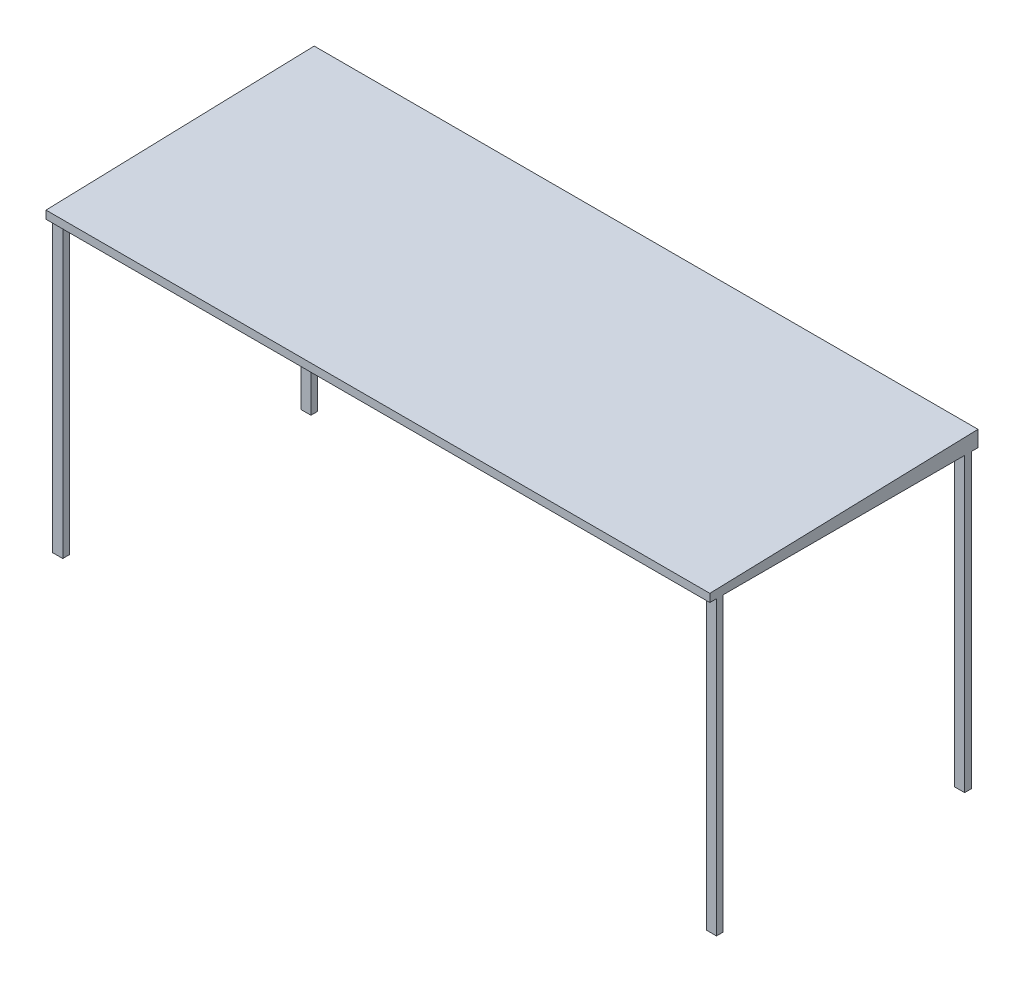
ISO-10303-21;
HEADER;
FILE_DESCRIPTION(('STEP AP214'),'2;1');
FILE_NAME('part.step','',(''),(''),'','','');
FILE_SCHEMA(('AUTOMOTIVE_DESIGN { 1 0 10303 214 1 1 1 1 }'));
ENDSEC;
DATA;
#1=APPLICATION_CONTEXT('core data for automotive mechanical design processes');
#2=APPLICATION_PROTOCOL_DEFINITION('international standard','automotive_design',2000,#1);
#3=PRODUCT_CONTEXT('',#1,'mechanical');
#4=PRODUCT('Part','Part','',(#3));
#5=PRODUCT_RELATED_PRODUCT_CATEGORY('part','',(#4));
#6=PRODUCT_DEFINITION_FORMATION('','',#4);
#7=PRODUCT_DEFINITION_CONTEXT('part definition',#1,'design');
#8=PRODUCT_DEFINITION('design','',#6,#7);
#9=PRODUCT_DEFINITION_SHAPE('','',#8);
#10=(LENGTH_UNIT() NAMED_UNIT(*) SI_UNIT(.MILLI.,.METRE.));
#11=(NAMED_UNIT(*) PLANE_ANGLE_UNIT() SI_UNIT($,.RADIAN.));
#12=(NAMED_UNIT(*) SI_UNIT($,.STERADIAN.) SOLID_ANGLE_UNIT());
#13=UNCERTAINTY_MEASURE_WITH_UNIT(LENGTH_MEASURE(1.E-05),#10,'distance_accuracy_value','');
#14=(GEOMETRIC_REPRESENTATION_CONTEXT(3) GLOBAL_UNCERTAINTY_ASSIGNED_CONTEXT((#13)) GLOBAL_UNIT_ASSIGNED_CONTEXT((#10,
#11,#12)) REPRESENTATION_CONTEXT('',''));
#15=CARTESIAN_POINT('',(0.,0.,0.));
#16=DIRECTION('',(0.,0.,1.));
#17=DIRECTION('',(1.,0.,0.));
#18=AXIS2_PLACEMENT_3D('',#15,#16,#17);
#19=CARTESIAN_POINT('',(-2023.5612172603,2200.,1970.));
#20=DIRECTION('',(0.,-1.,0.));
#21=DIRECTION('',(0.,0.,-1.));
#22=AXIS2_PLACEMENT_3D('',#19,#20,#21);
#23=PLANE('',#22);
#24=DIRECTION('',(0.,0.,-1.));
#25=VECTOR('',#24,1.);
#26=CARTESIAN_POINT('',(5000.,2200.,1970.));
#27=LINE('',#26,#25);
#28=CARTESIAN_POINT('',(5000.,2200.,1869.2));
#29=VERTEX_POINT('',#28);
#30=CARTESIAN_POINT('',(5000.,2200.,50.8));
#31=VERTEX_POINT('',#30);
#32=EDGE_CURVE('E197',#29,#31,#27,.T.);
#33=ORIENTED_EDGE('',*,*,#32,.F.);
#34=DIRECTION('',(-1.,0.,0.));
#35=VECTOR('',#34,1.);
#36=CARTESIAN_POINT('',(5000.,2200.,1869.2));
#37=LINE('',#36,#35);
#38=CARTESIAN_POINT('',(4923.8,2200.,1869.2));
#39=VERTEX_POINT('',#38);
#40=EDGE_CURVE('E180',#29,#39,#37,.T.);
#41=ORIENTED_EDGE('',*,*,#40,.T.);
#42=DIRECTION('',(0.,0.,1.));
#43=VECTOR('',#42,1.);
#44=CARTESIAN_POINT('',(4923.8,2200.,1920.));
#45=LINE('',#44,#43);
#46=CARTESIAN_POINT('',(4923.8,2200.,1920.));
#47=VERTEX_POINT('',#46);
#48=EDGE_CURVE('E188',#39,#47,#45,.T.);
#49=ORIENTED_EDGE('',*,*,#48,.T.);
#50=DIRECTION('',(1.,0.,0.));
#51=VECTOR('',#50,1.);
#52=CARTESIAN_POINT('',(5000.,2200.,1920.));
#53=LINE('',#52,#51);
#54=CARTESIAN_POINT('',(5000.,2200.,1920.));
#55=VERTEX_POINT('',#54);
#56=EDGE_CURVE('E194',#47,#55,#53,.T.);
#57=ORIENTED_EDGE('',*,*,#56,.T.);
#58=CARTESIAN_POINT('',(5000.,2200.,1970.));
#59=VERTEX_POINT('',#58);
#60=EDGE_CURVE('E281',#59,#55,#27,.T.);
#61=ORIENTED_EDGE('',*,*,#60,.F.);
#62=DIRECTION('',(1.,0.,0.));
#63=VECTOR('',#62,1.);
#64=CARTESIAN_POINT('',(-2023.5612172603,2200.,1970.));
#65=LINE('',#64,#63);
#66=CARTESIAN_POINT('',(4.44089209850063E-13,2200.,1970.));
#67=VERTEX_POINT('',#66);
#68=EDGE_CURVE('E290',#67,#59,#65,.T.);
#69=ORIENTED_EDGE('',*,*,#68,.F.);
#70=DIRECTION('',(0.,0.,1.));
#71=VECTOR('',#70,1.);
#72=CARTESIAN_POINT('',(4.44089209850063E-13,2200.,1970.));
#73=LINE('',#72,#71);
#74=CARTESIAN_POINT('',(4.37965975854326E-13,2200.,1920.));
#75=VERTEX_POINT('',#74);
#76=EDGE_CURVE('E277',#75,#67,#73,.T.);
#77=ORIENTED_EDGE('',*,*,#76,.F.);
#78=DIRECTION('',(1.,0.,0.));
#79=VECTOR('',#78,1.);
#80=CARTESIAN_POINT('',(8.88178419700125E-13,2200.,1920.));
#81=LINE('',#80,#79);
#82=CARTESIAN_POINT('',(76.2000000000009,2200.,1920.));
#83=VERTEX_POINT('',#82);
#84=EDGE_CURVE('E60',#75,#83,#81,.T.);
#85=ORIENTED_EDGE('',*,*,#84,.T.);
#86=DIRECTION('',(0.,0.,-1.));
#87=VECTOR('',#86,1.);
#88=CARTESIAN_POINT('',(76.2000000000009,2200.,1920.));
#89=LINE('',#88,#87);
#90=CARTESIAN_POINT('',(76.2000000000009,2200.,1869.2));
#91=VERTEX_POINT('',#90);
#92=EDGE_CURVE('E215',#83,#91,#89,.T.);
#93=ORIENTED_EDGE('',*,*,#92,.T.);
#94=DIRECTION('',(-1.,0.,0.));
#95=VECTOR('',#94,1.);
#96=CARTESIAN_POINT('',(8.88178419700125E-13,2200.,1869.2));
#97=LINE('',#96,#95);
#98=CARTESIAN_POINT('',(8.88178419700125E-13,2200.,1869.2));
#99=VERTEX_POINT('',#98);
#100=EDGE_CURVE('E219',#91,#99,#97,.T.);
#101=ORIENTED_EDGE('',*,*,#100,.T.);
#102=CARTESIAN_POINT('',(0.,2200.,50.8));
#103=VERTEX_POINT('',#102);
#104=EDGE_CURVE('E302',#103,#99,#73,.T.);
#105=ORIENTED_EDGE('',*,*,#104,.F.);
#106=DIRECTION('',(1.,0.,0.));
#107=VECTOR('',#106,1.);
#108=CARTESIAN_POINT('',(0.,2200.,50.8));
#109=LINE('',#108,#107);
#110=CARTESIAN_POINT('',(76.2,2200.,50.8));
#111=VERTEX_POINT('',#110);
#112=EDGE_CURVE('E303',#103,#111,#109,.T.);
#113=ORIENTED_EDGE('',*,*,#112,.T.);
#114=DIRECTION('',(0.,0.,-1.));
#115=VECTOR('',#114,1.);
#116=CARTESIAN_POINT('',(76.2,2200.,0.));
#117=LINE('',#116,#115);
#118=CARTESIAN_POINT('',(76.2,2200.,0.));
#119=VERTEX_POINT('',#118);
#120=EDGE_CURVE('E306',#111,#119,#117,.T.);
#121=ORIENTED_EDGE('',*,*,#120,.T.);
#122=DIRECTION('',(-1.,0.,0.));
#123=VECTOR('',#122,1.);
#124=CARTESIAN_POINT('',(0.,2200.,0.));
#125=LINE('',#124,#123);
#126=CARTESIAN_POINT('',(2.02833790418034E-13,2200.,0.));
#127=VERTEX_POINT('',#126);
#128=EDGE_CURVE('E310',#119,#127,#125,.T.);
#129=ORIENTED_EDGE('',*,*,#128,.T.);
#130=CARTESIAN_POINT('',(4.44089209850063E-13,2200.,-50.));
#131=VERTEX_POINT('',#130);
#132=EDGE_CURVE('E298',#131,#127,#73,.T.);
#133=ORIENTED_EDGE('',*,*,#132,.F.);
#134=DIRECTION('',(1.,0.,0.));
#135=VECTOR('',#134,1.);
#136=CARTESIAN_POINT('',(-2023.5612172603,2200.,-50.));
#137=LINE('',#136,#135);
#138=CARTESIAN_POINT('',(5000.,2200.,-50.));
#139=VERTEX_POINT('',#138);
#140=EDGE_CURVE('E294',#131,#139,#137,.T.);
#141=ORIENTED_EDGE('',*,*,#140,.T.);
#142=CARTESIAN_POINT('',(5000.,2200.,0.));
#143=VERTEX_POINT('',#142);
#144=EDGE_CURVE('E280',#143,#139,#27,.T.);
#145=ORIENTED_EDGE('',*,*,#144,.F.);
#146=DIRECTION('',(-1.,0.,0.));
#147=VECTOR('',#146,1.);
#148=CARTESIAN_POINT('',(5000.,2200.,0.));
#149=LINE('',#148,#147);
#150=CARTESIAN_POINT('',(4923.8,2200.,0.));
#151=VERTEX_POINT('',#150);
#152=EDGE_CURVE('E241',#143,#151,#149,.T.);
#153=ORIENTED_EDGE('',*,*,#152,.T.);
#154=DIRECTION('',(0.,0.,1.));
#155=VECTOR('',#154,1.);
#156=CARTESIAN_POINT('',(4923.8,2200.,0.));
#157=LINE('',#156,#155);
#158=CARTESIAN_POINT('',(4923.8,2200.,50.8));
#159=VERTEX_POINT('',#158);
#160=EDGE_CURVE('E244',#151,#159,#157,.T.);
#161=ORIENTED_EDGE('',*,*,#160,.T.);
#162=DIRECTION('',(1.,0.,0.));
#163=VECTOR('',#162,1.);
#164=CARTESIAN_POINT('',(5000.,2200.,50.8));
#165=LINE('',#164,#163);
#166=EDGE_CURVE('E248',#159,#31,#165,.T.);
#167=ORIENTED_EDGE('',*,*,#166,.T.);
#168=EDGE_LOOP('',(#33,#41,#49,#57,#61,#69,#77,#85,#93,#101,#105,#113,#121,#129,#133,#141,#145,
#153,#161,#167));
#169=FACE_BOUND('',#168,.T.);
#170=ADVANCED_FACE('F37',(#169),#23,.T.);
#171=CARTESIAN_POINT('',(0.,2200.,0.));
#172=DIRECTION('',(1.,0.,0.));
#173=DIRECTION('',(0.,0.,-1.));
#174=AXIS2_PLACEMENT_3D('',#171,#172,#173);
#175=PLANE('',#174);
#176=DIRECTION('',(0.,0.,1.));
#177=VECTOR('',#176,1.);
#178=CARTESIAN_POINT('',(0.,0.,0.));
#179=LINE('',#178,#177);
#180=CARTESIAN_POINT('',(0.,0.,0.));
#181=VERTEX_POINT('',#180);
#182=CARTESIAN_POINT('',(0.,0.,50.8));
#183=VERTEX_POINT('',#182);
#184=EDGE_CURVE('E301',#181,#183,#179,.T.);
#185=ORIENTED_EDGE('',*,*,#184,.T.);
#186=DIRECTION('',(0.,-1.,0.));
#187=VECTOR('',#186,1.);
#188=CARTESIAN_POINT('',(0.,2200.,50.8));
#189=LINE('',#188,#187);
#190=EDGE_CURVE('E11',#103,#183,#189,.T.);
#191=ORIENTED_EDGE('',*,*,#190,.F.);
#192=ORIENTED_EDGE('',*,*,#104,.T.);
#193=DIRECTION('',(0.,-1.,0.));
#194=VECTOR('',#193,1.);
#195=CARTESIAN_POINT('',(8.88178419700125E-13,2200.,1869.2));
#196=LINE('',#195,#194);
#197=CARTESIAN_POINT('',(8.88178419700125E-13,0.,1869.2));
#198=VERTEX_POINT('',#197);
#199=EDGE_CURVE('E231',#99,#198,#196,.T.);
#200=ORIENTED_EDGE('',*,*,#199,.T.);
#201=DIRECTION('',(0.,0.,1.));
#202=VECTOR('',#201,1.);
#203=CARTESIAN_POINT('',(8.88178419700125E-13,0.,1920.));
#204=LINE('',#203,#202);
#205=CARTESIAN_POINT('',(8.88178419700125E-13,0.,1920.));
#206=VERTEX_POINT('',#205);
#207=EDGE_CURVE('E216',#198,#206,#204,.T.);
#208=ORIENTED_EDGE('',*,*,#207,.T.);
#209=DIRECTION('',(0.,-1.,0.));
#210=VECTOR('',#209,1.);
#211=CARTESIAN_POINT('',(8.88178419700125E-13,2200.,1920.));
#212=LINE('',#211,#210);
#213=EDGE_CURVE('E222',#75,#206,#212,.T.);
#214=ORIENTED_EDGE('',*,*,#213,.F.);
#215=ORIENTED_EDGE('',*,*,#76,.T.);
#216=DIRECTION('',(0.,1.,0.));
#217=VECTOR('',#216,1.);
#218=CARTESIAN_POINT('',(4.44089209850063E-13,2260.,1970.));
#219=LINE('',#218,#217);
#220=CARTESIAN_POINT('',(2.47378653427765E-13,2260.,1970.));
#221=VERTEX_POINT('',#220);
#222=EDGE_CURVE('E275',#67,#221,#219,.T.);
#223=ORIENTED_EDGE('',*,*,#222,.T.);
#224=DIRECTION('',(0.,0.0296898759938942,-0.999559158461103));
#225=VECTOR('',#224,1.);
#226=CARTESIAN_POINT('',(0.,2320.,-50.0000000000003));
#227=LINE('',#226,#225);
#228=CARTESIAN_POINT('',(0.,2320.,-50.));
#229=VERTEX_POINT('',#228);
#230=EDGE_CURVE('E272',#221,#229,#227,.T.);
#231=ORIENTED_EDGE('',*,*,#230,.T.);
#232=DIRECTION('',(0.,-1.,0.));
#233=VECTOR('',#232,1.);
#234=CARTESIAN_POINT('',(0.,2200.,-50.));
#235=LINE('',#234,#233);
#236=EDGE_CURVE('E270',#229,#131,#235,.T.);
#237=ORIENTED_EDGE('',*,*,#236,.T.);
#238=ORIENTED_EDGE('',*,*,#132,.T.);
#239=DIRECTION('',(0.,-1.,0.));
#240=VECTOR('',#239,1.);
#241=CARTESIAN_POINT('',(0.,2200.,0.));
#242=LINE('',#241,#240);
#243=EDGE_CURVE('E313',#127,#181,#242,.T.);
#244=ORIENTED_EDGE('',*,*,#243,.T.);
#245=EDGE_LOOP('',(#185,#191,#192,#200,#208,#214,#215,#223,#231,#237,#238,#244));
#246=FACE_BOUND('',#245,.T.);
#247=ADVANCED_FACE('F39',(#246),#175,.F.);
#248=CARTESIAN_POINT('',(0.,2200.,50.8));
#249=DIRECTION('',(0.,0.,-1.));
#250=DIRECTION('',(-1.,0.,0.));
#251=AXIS2_PLACEMENT_3D('',#248,#249,#250);
#252=PLANE('',#251);
#253=DIRECTION('',(1.,0.,0.));
#254=VECTOR('',#253,1.);
#255=CARTESIAN_POINT('',(0.,0.,50.8));
#256=LINE('',#255,#254);
#257=CARTESIAN_POINT('',(76.2,0.,50.8));
#258=VERTEX_POINT('',#257);
#259=EDGE_CURVE('E316',#183,#258,#256,.T.);
#260=ORIENTED_EDGE('',*,*,#259,.T.);
#261=DIRECTION('',(0.,-1.,0.));
#262=VECTOR('',#261,1.);
#263=CARTESIAN_POINT('',(76.2,2200.,50.8));
#264=LINE('',#263,#262);
#265=EDGE_CURVE('E45',#111,#258,#264,.T.);
#266=ORIENTED_EDGE('',*,*,#265,.F.);
#267=ORIENTED_EDGE('',*,*,#112,.F.);
#268=ORIENTED_EDGE('',*,*,#190,.T.);
#269=EDGE_LOOP('',(#260,#266,#267,#268));
#270=FACE_BOUND('',#269,.T.);
#271=ADVANCED_FACE('F347',(#270),#252,.F.);
#272=CARTESIAN_POINT('',(76.2,2200.,0.));
#273=DIRECTION('',(-1.,0.,0.));
#274=DIRECTION('',(0.,0.,1.));
#275=AXIS2_PLACEMENT_3D('',#272,#273,#274);
#276=PLANE('',#275);
#277=DIRECTION('',(0.,0.,-1.));
#278=VECTOR('',#277,1.);
#279=CARTESIAN_POINT('',(76.2,0.,0.));
#280=LINE('',#279,#278);
#281=CARTESIAN_POINT('',(76.2,0.,0.));
#282=VERTEX_POINT('',#281);
#283=EDGE_CURVE('E318',#258,#282,#280,.T.);
#284=ORIENTED_EDGE('',*,*,#283,.T.);
#285=DIRECTION('',(0.,-1.,0.));
#286=VECTOR('',#285,1.);
#287=CARTESIAN_POINT('',(76.2,2200.,0.));
#288=LINE('',#287,#286);
#289=EDGE_CURVE('E323',#119,#282,#288,.T.);
#290=ORIENTED_EDGE('',*,*,#289,.F.);
#291=ORIENTED_EDGE('',*,*,#120,.F.);
#292=ORIENTED_EDGE('',*,*,#265,.T.);
#293=EDGE_LOOP('',(#284,#290,#291,#292));
#294=FACE_BOUND('',#293,.T.);
#295=ADVANCED_FACE('F329',(#294),#276,.F.);
#296=CARTESIAN_POINT('',(0.,2200.,0.));
#297=DIRECTION('',(0.,0.,1.));
#298=DIRECTION('',(1.,0.,0.));
#299=AXIS2_PLACEMENT_3D('',#296,#297,#298);
#300=PLANE('',#299);
#301=DIRECTION('',(-1.,0.,0.));
#302=VECTOR('',#301,1.);
#303=CARTESIAN_POINT('',(0.,0.,0.));
#304=LINE('',#303,#302);
#305=EDGE_CURVE('E307',#282,#181,#304,.T.);
#306=ORIENTED_EDGE('',*,*,#305,.T.);
#307=ORIENTED_EDGE('',*,*,#243,.F.);
#308=ORIENTED_EDGE('',*,*,#128,.F.);
#309=ORIENTED_EDGE('',*,*,#289,.T.);
#310=EDGE_LOOP('',(#306,#307,#308,#309));
#311=FACE_BOUND('',#310,.T.);
#312=ADVANCED_FACE('F336',(#311),#300,.F.);
#313=CARTESIAN_POINT('',(0.,0.,0.));
#314=DIRECTION('',(0.,1.,0.));
#315=DIRECTION('',(0.,0.,1.));
#316=AXIS2_PLACEMENT_3D('',#313,#314,#315);
#317=PLANE('',#316);
#318=ORIENTED_EDGE('',*,*,#184,.F.);
#319=ORIENTED_EDGE('',*,*,#305,.F.);
#320=ORIENTED_EDGE('',*,*,#283,.F.);
#321=ORIENTED_EDGE('',*,*,#259,.F.);
#322=EDGE_LOOP('',(#318,#319,#320,#321));
#323=FACE_BOUND('',#322,.T.);
#324=ADVANCED_FACE('F334',(#323),#317,.F.);
#325=CARTESIAN_POINT('',(-2023.5612172603,2260.,1970.));
#326=DIRECTION('',(0.,0.,1.));
#327=DIRECTION('',(0.,-1.,0.));
#328=AXIS2_PLACEMENT_3D('',#325,#326,#327);
#329=PLANE('',#328);
#330=ORIENTED_EDGE('',*,*,#222,.F.);
#331=ORIENTED_EDGE('',*,*,#68,.T.);
#332=DIRECTION('',(0.,-1.,0.));
#333=VECTOR('',#332,1.);
#334=CARTESIAN_POINT('',(5000.,2260.,1970.));
#335=LINE('',#334,#333);
#336=CARTESIAN_POINT('',(5000.,2260.,1970.));
#337=VERTEX_POINT('',#336);
#338=EDGE_CURVE('E269',#337,#59,#335,.T.);
#339=ORIENTED_EDGE('',*,*,#338,.F.);
#340=DIRECTION('',(1.,0.,0.));
#341=VECTOR('',#340,1.);
#342=CARTESIAN_POINT('',(-2023.5612172603,2260.,1970.));
#343=LINE('',#342,#341);
#344=EDGE_CURVE('E273',#221,#337,#343,.T.);
#345=ORIENTED_EDGE('',*,*,#344,.F.);
#346=EDGE_LOOP('',(#330,#331,#339,#345));
#347=FACE_BOUND('',#346,.T.);
#348=ADVANCED_FACE('F355',(#347),#329,.T.);
#349=CARTESIAN_POINT('',(-2023.5612172603,2320.,-50.));
#350=DIRECTION('',(0.,0.999559158461102,0.0296898759938942));
#351=DIRECTION('',(0.,-0.0296898759938942,0.999559158461103));
#352=AXIS2_PLACEMENT_3D('',#349,#350,#351);
#353=PLANE('',#352);
#354=ORIENTED_EDGE('',*,*,#230,.F.);
#355=ORIENTED_EDGE('',*,*,#344,.T.);
#356=DIRECTION('',(0.,-0.0296898759938942,0.999559158461103));
#357=VECTOR('',#356,1.);
#358=CARTESIAN_POINT('',(5000.,2320.,-50.));
#359=LINE('',#358,#357);
#360=CARTESIAN_POINT('',(5000.,2320.,-50.));
#361=VERTEX_POINT('',#360);
#362=EDGE_CURVE('E287',#361,#337,#359,.T.);
#363=ORIENTED_EDGE('',*,*,#362,.F.);
#364=DIRECTION('',(1.,0.,0.));
#365=VECTOR('',#364,1.);
#366=CARTESIAN_POINT('',(-2023.5612172603,2320.,-50.));
#367=LINE('',#366,#365);
#368=EDGE_CURVE('E292',#229,#361,#367,.T.);
#369=ORIENTED_EDGE('',*,*,#368,.F.);
#370=EDGE_LOOP('',(#354,#355,#363,#369));
#371=FACE_BOUND('',#370,.T.);
#372=ADVANCED_FACE('F362',(#371),#353,.T.);
#373=CARTESIAN_POINT('',(-2023.5612172603,2200.,-50.));
#374=DIRECTION('',(0.,0.,-1.));
#375=DIRECTION('',(-1.,0.,0.));
#376=AXIS2_PLACEMENT_3D('',#373,#374,#375);
#377=PLANE('',#376);
#378=ORIENTED_EDGE('',*,*,#236,.F.);
#379=ORIENTED_EDGE('',*,*,#368,.T.);
#380=DIRECTION('',(0.,1.,0.));
#381=VECTOR('',#380,1.);
#382=CARTESIAN_POINT('',(5000.,2200.,-50.));
#383=LINE('',#382,#381);
#384=EDGE_CURVE('E284',#139,#361,#383,.T.);
#385=ORIENTED_EDGE('',*,*,#384,.F.);
#386=ORIENTED_EDGE('',*,*,#140,.F.);
#387=EDGE_LOOP('',(#378,#379,#385,#386));
#388=FACE_BOUND('',#387,.T.);
#389=ADVANCED_FACE('F364',(#388),#377,.T.);
#390=CARTESIAN_POINT('',(5000.,0.,0.));
#391=DIRECTION('',(1.,0.,0.));
#392=DIRECTION('',(0.,0.,-1.));
#393=AXIS2_PLACEMENT_3D('',#390,#391,#392);
#394=PLANE('',#393);
#395=ORIENTED_EDGE('',*,*,#338,.T.);
#396=ORIENTED_EDGE('',*,*,#60,.T.);
#397=DIRECTION('',(0.,-1.,0.));
#398=VECTOR('',#397,1.);
#399=CARTESIAN_POINT('',(5000.,2200.,1920.));
#400=LINE('',#399,#398);
#401=CARTESIAN_POINT('',(5000.,0.,1920.));
#402=VERTEX_POINT('',#401);
#403=EDGE_CURVE('E204',#55,#402,#400,.T.);
#404=ORIENTED_EDGE('',*,*,#403,.T.);
#405=DIRECTION('',(0.,0.,-1.));
#406=VECTOR('',#405,1.);
#407=CARTESIAN_POINT('',(5000.,0.,1920.));
#408=LINE('',#407,#406);
#409=CARTESIAN_POINT('',(5000.,0.,1869.2));
#410=VERTEX_POINT('',#409);
#411=EDGE_CURVE('E205',#402,#410,#408,.T.);
#412=ORIENTED_EDGE('',*,*,#411,.T.);
#413=DIRECTION('',(0.,-1.,0.));
#414=VECTOR('',#413,1.);
#415=CARTESIAN_POINT('',(5000.,2200.,1869.2));
#416=LINE('',#415,#414);
#417=EDGE_CURVE('E52',#29,#410,#416,.T.);
#418=ORIENTED_EDGE('',*,*,#417,.F.);
#419=ORIENTED_EDGE('',*,*,#32,.T.);
#420=DIRECTION('',(0.,-1.,0.));
#421=VECTOR('',#420,1.);
#422=CARTESIAN_POINT('',(5000.,2200.,50.8));
#423=LINE('',#422,#421);
#424=CARTESIAN_POINT('',(5000.,0.,50.8));
#425=VERTEX_POINT('',#424);
#426=EDGE_CURVE('E260',#31,#425,#423,.T.);
#427=ORIENTED_EDGE('',*,*,#426,.T.);
#428=DIRECTION('',(0.,0.,-1.));
#429=VECTOR('',#428,1.);
#430=CARTESIAN_POINT('',(5000.,0.,0.));
#431=LINE('',#430,#429);
#432=CARTESIAN_POINT('',(5000.,0.,0.));
#433=VERTEX_POINT('',#432);
#434=EDGE_CURVE('E245',#425,#433,#431,.T.);
#435=ORIENTED_EDGE('',*,*,#434,.T.);
#436=DIRECTION('',(0.,-1.,0.));
#437=VECTOR('',#436,1.);
#438=CARTESIAN_POINT('',(5000.,2200.,0.));
#439=LINE('',#438,#437);
#440=EDGE_CURVE('E250',#143,#433,#439,.T.);
#441=ORIENTED_EDGE('',*,*,#440,.F.);
#442=ORIENTED_EDGE('',*,*,#144,.T.);
#443=ORIENTED_EDGE('',*,*,#384,.T.);
#444=ORIENTED_EDGE('',*,*,#362,.T.);
#445=EDGE_LOOP('',(#395,#396,#404,#412,#418,#419,#427,#435,#441,#442,#443,#444));
#446=FACE_BOUND('',#445,.T.);
#447=ADVANCED_FACE('F358',(#446),#394,.T.);
#448=CARTESIAN_POINT('',(5000.,2200.,0.));
#449=DIRECTION('',(0.,0.,1.));
#450=DIRECTION('',(1.,0.,0.));
#451=AXIS2_PLACEMENT_3D('',#448,#449,#450);
#452=PLANE('',#451);
#453=DIRECTION('',(-1.,0.,0.));
#454=VECTOR('',#453,1.);
#455=CARTESIAN_POINT('',(5000.,0.,0.));
#456=LINE('',#455,#454);
#457=CARTESIAN_POINT('',(4923.8,0.,0.));
#458=VERTEX_POINT('',#457);
#459=EDGE_CURVE('E240',#433,#458,#456,.T.);
#460=ORIENTED_EDGE('',*,*,#459,.T.);
#461=DIRECTION('',(0.,-1.,0.));
#462=VECTOR('',#461,1.);
#463=CARTESIAN_POINT('',(4923.8,2200.,0.));
#464=LINE('',#463,#462);
#465=EDGE_CURVE('E266',#151,#458,#464,.T.);
#466=ORIENTED_EDGE('',*,*,#465,.F.);
#467=ORIENTED_EDGE('',*,*,#152,.F.);
#468=ORIENTED_EDGE('',*,*,#440,.T.);
#469=EDGE_LOOP('',(#460,#466,#467,#468));
#470=FACE_BOUND('',#469,.T.);
#471=ADVANCED_FACE('F371',(#470),#452,.F.);
#472=CARTESIAN_POINT('',(4923.8,2200.,0.));
#473=DIRECTION('',(1.,0.,0.));
#474=DIRECTION('',(0.,0.,-1.));
#475=AXIS2_PLACEMENT_3D('',#472,#473,#474);
#476=PLANE('',#475);
#477=DIRECTION('',(0.,0.,1.));
#478=VECTOR('',#477,1.);
#479=CARTESIAN_POINT('',(4923.8,0.,0.));
#480=LINE('',#479,#478);
#481=CARTESIAN_POINT('',(4923.8,0.,50.8));
#482=VERTEX_POINT('',#481);
#483=EDGE_CURVE('E253',#458,#482,#480,.T.);
#484=ORIENTED_EDGE('',*,*,#483,.T.);
#485=DIRECTION('',(0.,-1.,0.));
#486=VECTOR('',#485,1.);
#487=CARTESIAN_POINT('',(4923.8,2200.,50.8));
#488=LINE('',#487,#486);
#489=EDGE_CURVE('E263',#159,#482,#488,.T.);
#490=ORIENTED_EDGE('',*,*,#489,.F.);
#491=ORIENTED_EDGE('',*,*,#160,.F.);
#492=ORIENTED_EDGE('',*,*,#465,.T.);
#493=EDGE_LOOP('',(#484,#490,#491,#492));
#494=FACE_BOUND('',#493,.T.);
#495=ADVANCED_FACE('F432',(#494),#476,.F.);
#496=CARTESIAN_POINT('',(5000.,2200.,50.8));
#497=DIRECTION('',(0.,0.,-1.));
#498=DIRECTION('',(-1.,0.,0.));
#499=AXIS2_PLACEMENT_3D('',#496,#497,#498);
#500=PLANE('',#499);
#501=DIRECTION('',(1.,0.,0.));
#502=VECTOR('',#501,1.);
#503=CARTESIAN_POINT('',(5000.,0.,50.8));
#504=LINE('',#503,#502);
#505=EDGE_CURVE('E255',#482,#425,#504,.T.);
#506=ORIENTED_EDGE('',*,*,#505,.T.);
#507=ORIENTED_EDGE('',*,*,#426,.F.);
#508=ORIENTED_EDGE('',*,*,#166,.F.);
#509=ORIENTED_EDGE('',*,*,#489,.T.);
#510=EDGE_LOOP('',(#506,#507,#508,#509));
#511=FACE_BOUND('',#510,.T.);
#512=ADVANCED_FACE('F442',(#511),#500,.F.);
#513=CARTESIAN_POINT('',(0.,0.,0.));
#514=DIRECTION('',(0.,1.,0.));
#515=DIRECTION('',(0.,0.,1.));
#516=AXIS2_PLACEMENT_3D('',#513,#514,#515);
#517=PLANE('',#516);
#518=ORIENTED_EDGE('',*,*,#459,.F.);
#519=ORIENTED_EDGE('',*,*,#434,.F.);
#520=ORIENTED_EDGE('',*,*,#505,.F.);
#521=ORIENTED_EDGE('',*,*,#483,.F.);
#522=EDGE_LOOP('',(#518,#519,#520,#521));
#523=FACE_BOUND('',#522,.T.);
#524=ADVANCED_FACE('F452',(#523),#517,.F.);
#525=CARTESIAN_POINT('',(8.88178419700125E-13,2200.,1920.));
#526=DIRECTION('',(0.,0.,-1.));
#527=DIRECTION('',(-1.,0.,0.));
#528=AXIS2_PLACEMENT_3D('',#525,#526,#527);
#529=PLANE('',#528);
#530=DIRECTION('',(1.,0.,0.));
#531=VECTOR('',#530,1.);
#532=CARTESIAN_POINT('',(8.88178419700125E-13,0.,1920.));
#533=LINE('',#532,#531);
#534=CARTESIAN_POINT('',(76.2000000000009,0.,1920.));
#535=VERTEX_POINT('',#534);
#536=EDGE_CURVE('E213',#206,#535,#533,.T.);
#537=ORIENTED_EDGE('',*,*,#536,.T.);
#538=DIRECTION('',(0.,-1.,0.));
#539=VECTOR('',#538,1.);
#540=CARTESIAN_POINT('',(76.2000000000009,2200.,1920.));
#541=LINE('',#540,#539);
#542=EDGE_CURVE('E237',#83,#535,#541,.T.);
#543=ORIENTED_EDGE('',*,*,#542,.F.);
#544=ORIENTED_EDGE('',*,*,#84,.F.);
#545=ORIENTED_EDGE('',*,*,#213,.T.);
#546=EDGE_LOOP('',(#537,#543,#544,#545));
#547=FACE_BOUND('',#546,.T.);
#548=ADVANCED_FACE('F462',(#547),#529,.F.);
#549=CARTESIAN_POINT('',(76.2000000000009,2200.,1920.));
#550=DIRECTION('',(-1.,0.,0.));
#551=DIRECTION('',(0.,0.,1.));
#552=AXIS2_PLACEMENT_3D('',#549,#550,#551);
#553=PLANE('',#552);
#554=DIRECTION('',(0.,0.,-1.));
#555=VECTOR('',#554,1.);
#556=CARTESIAN_POINT('',(76.2000000000009,0.,1920.));
#557=LINE('',#556,#555);
#558=CARTESIAN_POINT('',(76.2000000000009,0.,1869.2));
#559=VERTEX_POINT('',#558);
#560=EDGE_CURVE('E225',#535,#559,#557,.T.);
#561=ORIENTED_EDGE('',*,*,#560,.T.);
#562=DIRECTION('',(0.,-1.,0.));
#563=VECTOR('',#562,1.);
#564=CARTESIAN_POINT('',(76.2000000000009,2200.,1869.2));
#565=LINE('',#564,#563);
#566=EDGE_CURVE('E234',#91,#559,#565,.T.);
#567=ORIENTED_EDGE('',*,*,#566,.F.);
#568=ORIENTED_EDGE('',*,*,#92,.F.);
#569=ORIENTED_EDGE('',*,*,#542,.T.);
#570=EDGE_LOOP('',(#561,#567,#568,#569));
#571=FACE_BOUND('',#570,.T.);
#572=ADVANCED_FACE('F473',(#571),#553,.F.);
#573=CARTESIAN_POINT('',(8.88178419700125E-13,2200.,1869.2));
#574=DIRECTION('',(0.,0.,1.));
#575=DIRECTION('',(1.,0.,0.));
#576=AXIS2_PLACEMENT_3D('',#573,#574,#575);
#577=PLANE('',#576);
#578=DIRECTION('',(-1.,0.,0.));
#579=VECTOR('',#578,1.);
#580=CARTESIAN_POINT('',(8.88178419700125E-13,0.,1869.2));
#581=LINE('',#580,#579);
#582=EDGE_CURVE('E227',#559,#198,#581,.T.);
#583=ORIENTED_EDGE('',*,*,#582,.T.);
#584=ORIENTED_EDGE('',*,*,#199,.F.);
#585=ORIENTED_EDGE('',*,*,#100,.F.);
#586=ORIENTED_EDGE('',*,*,#566,.T.);
#587=EDGE_LOOP('',(#583,#584,#585,#586));
#588=FACE_BOUND('',#587,.T.);
#589=ADVANCED_FACE('F482',(#588),#577,.F.);
#590=CARTESIAN_POINT('',(0.,0.,0.));
#591=DIRECTION('',(0.,1.,0.));
#592=DIRECTION('',(0.,0.,1.));
#593=AXIS2_PLACEMENT_3D('',#590,#591,#592);
#594=PLANE('',#593);
#595=ORIENTED_EDGE('',*,*,#536,.F.);
#596=ORIENTED_EDGE('',*,*,#207,.F.);
#597=ORIENTED_EDGE('',*,*,#582,.F.);
#598=ORIENTED_EDGE('',*,*,#560,.F.);
#599=EDGE_LOOP('',(#595,#596,#597,#598));
#600=FACE_BOUND('',#599,.T.);
#601=ADVANCED_FACE('F492',(#600),#594,.F.);
#602=CARTESIAN_POINT('',(5000.,2200.,1869.2));
#603=DIRECTION('',(0.,0.,1.));
#604=DIRECTION('',(1.,0.,0.));
#605=AXIS2_PLACEMENT_3D('',#602,#603,#604);
#606=PLANE('',#605);
#607=DIRECTION('',(-1.,0.,0.));
#608=VECTOR('',#607,1.);
#609=CARTESIAN_POINT('',(5000.,0.,1869.2));
#610=LINE('',#609,#608);
#611=CARTESIAN_POINT('',(4923.8,0.,1869.2));
#612=VERTEX_POINT('',#611);
#613=EDGE_CURVE('E182',#410,#612,#610,.T.);
#614=ORIENTED_EDGE('',*,*,#613,.T.);
#615=DIRECTION('',(0.,-1.,0.));
#616=VECTOR('',#615,1.);
#617=CARTESIAN_POINT('',(4923.8,2200.,1869.2));
#618=LINE('',#617,#616);
#619=EDGE_CURVE('E176',#39,#612,#618,.T.);
#620=ORIENTED_EDGE('',*,*,#619,.F.);
#621=ORIENTED_EDGE('',*,*,#40,.F.);
#622=ORIENTED_EDGE('',*,*,#417,.T.);
#623=EDGE_LOOP('',(#614,#620,#621,#622));
#624=FACE_BOUND('',#623,.T.);
#625=ADVANCED_FACE('F178',(#624),#606,.F.);
#626=CARTESIAN_POINT('',(4923.8,2200.,1920.));
#627=DIRECTION('',(1.,0.,0.));
#628=DIRECTION('',(0.,0.,-1.));
#629=AXIS2_PLACEMENT_3D('',#626,#627,#628);
#630=PLANE('',#629);
#631=DIRECTION('',(0.,0.,1.));
#632=VECTOR('',#631,1.);
#633=CARTESIAN_POINT('',(4923.8,0.,1920.));
#634=LINE('',#633,#632);
#635=CARTESIAN_POINT('',(4923.8,0.,1920.));
#636=VERTEX_POINT('',#635);
#637=EDGE_CURVE('E200',#612,#636,#634,.T.);
#638=ORIENTED_EDGE('',*,*,#637,.T.);
#639=DIRECTION('',(0.,-1.,0.));
#640=VECTOR('',#639,1.);
#641=CARTESIAN_POINT('',(4923.8,2200.,1920.));
#642=LINE('',#641,#640);
#643=EDGE_CURVE('E185',#47,#636,#642,.T.);
#644=ORIENTED_EDGE('',*,*,#643,.F.);
#645=ORIENTED_EDGE('',*,*,#48,.F.);
#646=ORIENTED_EDGE('',*,*,#619,.T.);
#647=EDGE_LOOP('',(#638,#644,#645,#646));
#648=FACE_BOUND('',#647,.T.);
#649=ADVANCED_FACE('F189',(#648),#630,.F.);
#650=CARTESIAN_POINT('',(5000.,2200.,1920.));
#651=DIRECTION('',(0.,0.,-1.));
#652=DIRECTION('',(-1.,0.,0.));
#653=AXIS2_PLACEMENT_3D('',#650,#651,#652);
#654=PLANE('',#653);
#655=DIRECTION('',(1.,0.,0.));
#656=VECTOR('',#655,1.);
#657=CARTESIAN_POINT('',(5000.,0.,1920.));
#658=LINE('',#657,#656);
#659=EDGE_CURVE('E198',#636,#402,#658,.T.);
#660=ORIENTED_EDGE('',*,*,#659,.T.);
#661=ORIENTED_EDGE('',*,*,#403,.F.);
#662=ORIENTED_EDGE('',*,*,#56,.F.);
#663=ORIENTED_EDGE('',*,*,#643,.T.);
#664=EDGE_LOOP('',(#660,#661,#662,#663));
#665=FACE_BOUND('',#664,.T.);
#666=ADVANCED_FACE('F520',(#665),#654,.F.);
#667=CARTESIAN_POINT('',(0.,0.,0.));
#668=DIRECTION('',(0.,1.,0.));
#669=DIRECTION('',(0.,0.,1.));
#670=AXIS2_PLACEMENT_3D('',#667,#668,#669);
#671=PLANE('',#670);
#672=ORIENTED_EDGE('',*,*,#411,.F.);
#673=ORIENTED_EDGE('',*,*,#659,.F.);
#674=ORIENTED_EDGE('',*,*,#637,.F.);
#675=ORIENTED_EDGE('',*,*,#613,.F.);
#676=EDGE_LOOP('',(#672,#673,#674,#675));
#677=FACE_BOUND('',#676,.T.);
#678=ADVANCED_FACE('F529',(#677),#671,.F.);
#679=CLOSED_SHELL('',(#170,#247,#271,#295,#312,#324,#348,#372,#389,#447,#471,#495,#512,#524,
#548,#572,#589,#601,#625,#649,#666,#678));
#680=MANIFOLD_SOLID_BREP('B2',#679);
#681=ADVANCED_BREP_SHAPE_REPRESENTATION('',(#18,#680),#14);
#682=SHAPE_DEFINITION_REPRESENTATION(#9,#681);
ENDSEC;
END-ISO-10303-21;
